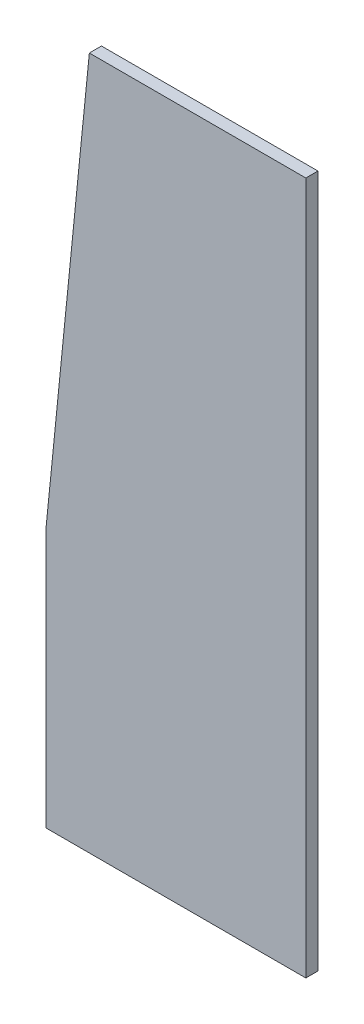
ISO-10303-21;
HEADER;
FILE_DESCRIPTION(('STEP AP214'),'2;1');
FILE_NAME('part.step','',(''),(''),'','','');
FILE_SCHEMA(('AUTOMOTIVE_DESIGN { 1 0 10303 214 1 1 1 1 }'));
ENDSEC;
DATA;
#1=APPLICATION_CONTEXT('core data for automotive mechanical design processes');
#2=APPLICATION_PROTOCOL_DEFINITION('international standard','automotive_design',2000,#1);
#3=PRODUCT_CONTEXT('',#1,'mechanical');
#4=PRODUCT('Part','Part','',(#3));
#5=PRODUCT_RELATED_PRODUCT_CATEGORY('part','',(#4));
#6=PRODUCT_DEFINITION_FORMATION('','',#4);
#7=PRODUCT_DEFINITION_CONTEXT('part definition',#1,'design');
#8=PRODUCT_DEFINITION('design','',#6,#7);
#9=PRODUCT_DEFINITION_SHAPE('','',#8);
#10=(LENGTH_UNIT() NAMED_UNIT(*) SI_UNIT(.MILLI.,.METRE.));
#11=(NAMED_UNIT(*) PLANE_ANGLE_UNIT() SI_UNIT($,.RADIAN.));
#12=(NAMED_UNIT(*) SI_UNIT($,.STERADIAN.) SOLID_ANGLE_UNIT());
#13=UNCERTAINTY_MEASURE_WITH_UNIT(LENGTH_MEASURE(1.E-05),#10,'distance_accuracy_value','');
#14=(GEOMETRIC_REPRESENTATION_CONTEXT(3) GLOBAL_UNCERTAINTY_ASSIGNED_CONTEXT((#13)) GLOBAL_UNIT_ASSIGNED_CONTEXT((#10,
#11,#12)) REPRESENTATION_CONTEXT('',''));
#15=CARTESIAN_POINT('',(0.,0.,0.));
#16=DIRECTION('',(0.,0.,1.));
#17=DIRECTION('',(1.,0.,0.));
#18=AXIS2_PLACEMENT_3D('',#15,#16,#17);
#19=CARTESIAN_POINT('',(-42.9529421238921,356.78858140725,3.556));
#20=DIRECTION('',(1.,0.,0.));
#21=DIRECTION('',(0.,0.,-1.));
#22=AXIS2_PLACEMENT_3D('',#19,#20,#21);
#23=PLANE('',#22);
#24=DIRECTION('',(0.,-1.,0.));
#25=VECTOR('',#24,1.);
#26=CARTESIAN_POINT('',(-42.9529421238921,356.78858140725,0.));
#27=LINE('',#26,#25);
#28=CARTESIAN_POINT('',(-42.9529421238921,356.78858140725,0.));
#29=VERTEX_POINT('',#28);
#30=CARTESIAN_POINT('',(-42.9529421238921,280.58858140725,0.));
#31=VERTEX_POINT('',#30);
#32=EDGE_CURVE('E107',#29,#31,#27,.T.);
#33=ORIENTED_EDGE('',*,*,#32,.T.);
#34=DIRECTION('',(0.,0.,-1.));
#35=VECTOR('',#34,1.);
#36=CARTESIAN_POINT('',(-42.9529421238921,280.58858140725,3.556));
#37=LINE('',#36,#35);
#38=CARTESIAN_POINT('',(-42.9529421238921,280.58858140725,3.556));
#39=VERTEX_POINT('',#38);
#40=EDGE_CURVE('E11',#39,#31,#37,.T.);
#41=ORIENTED_EDGE('',*,*,#40,.F.);
#42=DIRECTION('',(0.,-1.,0.));
#43=VECTOR('',#42,1.);
#44=CARTESIAN_POINT('',(-42.9529421238921,356.78858140725,3.556));
#45=LINE('',#44,#43);
#46=CARTESIAN_POINT('',(-42.9529421238921,356.78858140725,3.556));
#47=VERTEX_POINT('',#46);
#48=EDGE_CURVE('E117',#47,#39,#45,.T.);
#49=ORIENTED_EDGE('',*,*,#48,.F.);
#50=DIRECTION('',(0.,0.,-1.));
#51=VECTOR('',#50,1.);
#52=CARTESIAN_POINT('',(-42.9529421238921,356.78858140725,3.556));
#53=LINE('',#52,#51);
#54=EDGE_CURVE('E48',#47,#29,#53,.T.);
#55=ORIENTED_EDGE('',*,*,#54,.T.);
#56=EDGE_LOOP('',(#33,#41,#49,#55));
#57=FACE_BOUND('',#56,.T.);
#58=ADVANCED_FACE('F32',(#57),#23,.F.);
#59=CARTESIAN_POINT('',(-42.9529421238921,280.58858140725,3.556));
#60=DIRECTION('',(0.,1.,0.));
#61=DIRECTION('',(0.,0.,1.));
#62=AXIS2_PLACEMENT_3D('',#59,#60,#61);
#63=PLANE('',#62);
#64=DIRECTION('',(1.,0.,0.));
#65=VECTOR('',#64,1.);
#66=CARTESIAN_POINT('',(-42.9529421238921,280.58858140725,0.));
#67=LINE('',#66,#65);
#68=CARTESIAN_POINT('',(33.2470578761079,280.58858140725,0.));
#69=VERTEX_POINT('',#68);
#70=EDGE_CURVE('E109',#31,#69,#67,.T.);
#71=ORIENTED_EDGE('',*,*,#70,.T.);
#72=DIRECTION('',(0.,0.,-1.));
#73=VECTOR('',#72,1.);
#74=CARTESIAN_POINT('',(33.2470578761079,280.58858140725,3.556));
#75=LINE('',#74,#73);
#76=CARTESIAN_POINT('',(33.2470578761079,280.58858140725,3.556));
#77=VERTEX_POINT('',#76);
#78=EDGE_CURVE('E40',#77,#69,#75,.T.);
#79=ORIENTED_EDGE('',*,*,#78,.F.);
#80=DIRECTION('',(1.,0.,0.));
#81=VECTOR('',#80,1.);
#82=CARTESIAN_POINT('',(-42.9529421238921,280.58858140725,3.556));
#83=LINE('',#82,#81);
#84=EDGE_CURVE('E78',#39,#77,#83,.T.);
#85=ORIENTED_EDGE('',*,*,#84,.F.);
#86=ORIENTED_EDGE('',*,*,#40,.T.);
#87=EDGE_LOOP('',(#71,#79,#85,#86));
#88=FACE_BOUND('',#87,.T.);
#89=ADVANCED_FACE('F132',(#88),#63,.F.);
#90=CARTESIAN_POINT('',(33.2470578761079,280.58858140725,3.556));
#91=DIRECTION('',(-1.,0.,0.));
#92=DIRECTION('',(0.,0.,1.));
#93=AXIS2_PLACEMENT_3D('',#90,#91,#92);
#94=PLANE('',#93);
#95=DIRECTION('',(0.,1.,0.));
#96=VECTOR('',#95,1.);
#97=CARTESIAN_POINT('',(33.2470578761079,280.58858140725,0.));
#98=LINE('',#97,#96);
#99=CARTESIAN_POINT('',(33.2470578761079,483.78858140725,0.));
#100=VERTEX_POINT('',#99);
#101=EDGE_CURVE('E97',#69,#100,#98,.T.);
#102=ORIENTED_EDGE('',*,*,#101,.T.);
#103=DIRECTION('',(0.,0.,-1.));
#104=VECTOR('',#103,1.);
#105=CARTESIAN_POINT('',(33.2470578761079,483.78858140725,3.556));
#106=LINE('',#105,#104);
#107=CARTESIAN_POINT('',(33.2470578761079,483.78858140725,3.556));
#108=VERTEX_POINT('',#107);
#109=EDGE_CURVE('E94',#108,#100,#106,.T.);
#110=ORIENTED_EDGE('',*,*,#109,.F.);
#111=DIRECTION('',(0.,1.,0.));
#112=VECTOR('',#111,1.);
#113=CARTESIAN_POINT('',(33.2470578761079,280.58858140725,3.556));
#114=LINE('',#113,#112);
#115=EDGE_CURVE('E84',#77,#108,#114,.T.);
#116=ORIENTED_EDGE('',*,*,#115,.F.);
#117=ORIENTED_EDGE('',*,*,#78,.T.);
#118=EDGE_LOOP('',(#102,#110,#116,#117));
#119=FACE_BOUND('',#118,.T.);
#120=ADVANCED_FACE('F95',(#119),#94,.F.);
#121=CARTESIAN_POINT('',(33.2470578761079,483.78858140725,3.556));
#122=DIRECTION('',(0.,-1.,0.));
#123=DIRECTION('',(0.,0.,-1.));
#124=AXIS2_PLACEMENT_3D('',#121,#122,#123);
#125=PLANE('',#124);
#126=DIRECTION('',(-1.,0.,0.));
#127=VECTOR('',#126,1.);
#128=CARTESIAN_POINT('',(33.2470578761079,483.78858140725,0.));
#129=LINE('',#128,#127);
#130=CARTESIAN_POINT('',(-30.2529421238921,483.78858140725,0.));
#131=VERTEX_POINT('',#130);
#132=EDGE_CURVE('E112',#100,#131,#129,.T.);
#133=ORIENTED_EDGE('',*,*,#132,.T.);
#134=DIRECTION('',(0.,0.,-1.));
#135=VECTOR('',#134,1.);
#136=CARTESIAN_POINT('',(-30.2529421238921,483.78858140725,3.556));
#137=LINE('',#136,#135);
#138=CARTESIAN_POINT('',(-30.2529421238921,483.78858140725,3.556));
#139=VERTEX_POINT('',#138);
#140=EDGE_CURVE('E66',#139,#131,#137,.T.);
#141=ORIENTED_EDGE('',*,*,#140,.F.);
#142=DIRECTION('',(-1.,0.,0.));
#143=VECTOR('',#142,1.);
#144=CARTESIAN_POINT('',(33.2470578761079,483.78858140725,3.556));
#145=LINE('',#144,#143);
#146=EDGE_CURVE('E89',#108,#139,#145,.T.);
#147=ORIENTED_EDGE('',*,*,#146,.F.);
#148=ORIENTED_EDGE('',*,*,#109,.T.);
#149=EDGE_LOOP('',(#133,#141,#147,#148));
#150=FACE_BOUND('',#149,.T.);
#151=ADVANCED_FACE('F101',(#150),#125,.F.);
#152=CARTESIAN_POINT('',(-42.9529421238921,356.78858140725,3.556));
#153=DIRECTION('',(-0.995037190209989,0.0995037190209991,0.));
#154=DIRECTION('',(-0.0995037190209991,-0.995037190209989,0.));
#155=AXIS2_PLACEMENT_3D('',#152,#153,#154);
#156=PLANE('',#155);
#157=DIRECTION('',(0.0995037190209991,0.995037190209989,0.));
#158=VECTOR('',#157,1.);
#159=CARTESIAN_POINT('',(-42.9529421238921,356.78858140725,0.));
#160=LINE('',#159,#158);
#161=EDGE_CURVE('E114',#29,#131,#160,.T.);
#162=ORIENTED_EDGE('',*,*,#161,.F.);
#163=ORIENTED_EDGE('',*,*,#54,.F.);
#164=DIRECTION('',(0.0995037190209991,0.995037190209989,0.));
#165=VECTOR('',#164,1.);
#166=CARTESIAN_POINT('',(-42.9529421238921,356.78858140725,3.556));
#167=LINE('',#166,#165);
#168=EDGE_CURVE('E102',#47,#139,#167,.T.);
#169=ORIENTED_EDGE('',*,*,#168,.T.);
#170=ORIENTED_EDGE('',*,*,#140,.T.);
#171=EDGE_LOOP('',(#162,#163,#169,#170));
#172=FACE_BOUND('',#171,.T.);
#173=ADVANCED_FACE('F121',(#172),#156,.T.);
#174=CARTESIAN_POINT('',(0.,0.,3.556));
#175=DIRECTION('',(0.,0.,1.));
#176=DIRECTION('',(1.,0.,0.));
#177=AXIS2_PLACEMENT_3D('',#174,#175,#176);
#178=PLANE('',#177);
#179=ORIENTED_EDGE('',*,*,#48,.T.);
#180=ORIENTED_EDGE('',*,*,#84,.T.);
#181=ORIENTED_EDGE('',*,*,#115,.T.);
#182=ORIENTED_EDGE('',*,*,#146,.T.);
#183=ORIENTED_EDGE('',*,*,#168,.F.);
#184=EDGE_LOOP('',(#179,#180,#181,#182,#183));
#185=FACE_BOUND('',#184,.T.);
#186=ADVANCED_FACE('F86',(#185),#178,.T.);
#187=CARTESIAN_POINT('',(0.,0.,0.));
#188=DIRECTION('',(0.,0.,1.));
#189=DIRECTION('',(1.,0.,0.));
#190=AXIS2_PLACEMENT_3D('',#187,#188,#189);
#191=PLANE('',#190);
#192=ORIENTED_EDGE('',*,*,#32,.F.);
#193=ORIENTED_EDGE('',*,*,#161,.T.);
#194=ORIENTED_EDGE('',*,*,#132,.F.);
#195=ORIENTED_EDGE('',*,*,#101,.F.);
#196=ORIENTED_EDGE('',*,*,#70,.F.);
#197=EDGE_LOOP('',(#192,#193,#194,#195,#196));
#198=FACE_BOUND('',#197,.T.);
#199=ADVANCED_FACE('F120',(#198),#191,.F.);
#200=CLOSED_SHELL('',(#58,#89,#120,#151,#173,#186,#199));
#201=MANIFOLD_SOLID_BREP('B2',#200);
#202=ADVANCED_BREP_SHAPE_REPRESENTATION('',(#18,#201),#14);
#203=SHAPE_DEFINITION_REPRESENTATION(#9,#202);
ENDSEC;
END-ISO-10303-21;
